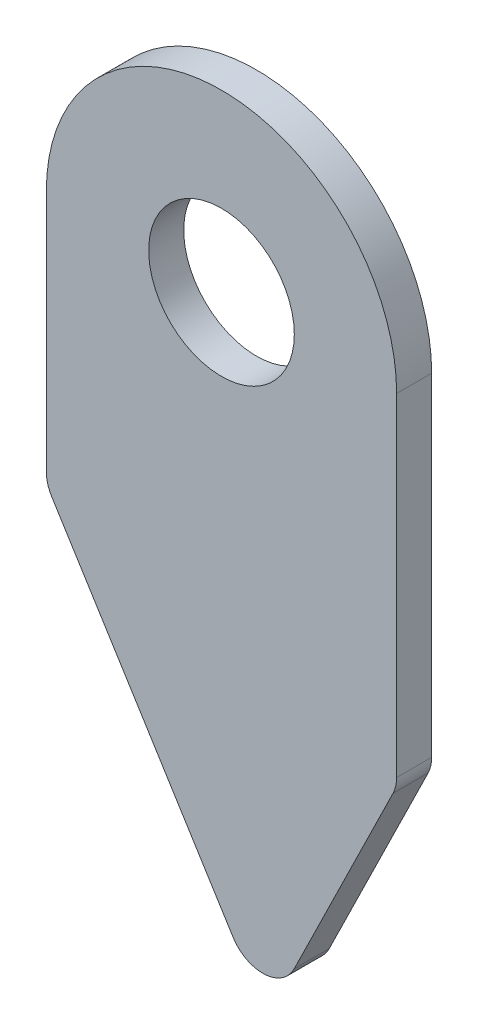
ISO-10303-21;
HEADER;
FILE_DESCRIPTION(('STEP AP214'),'2;1');
FILE_NAME('part.step','',(''),(''),'','','');
FILE_SCHEMA(('AUTOMOTIVE_DESIGN { 1 0 10303 214 1 1 1 1 }'));
ENDSEC;
DATA;
#1=APPLICATION_CONTEXT('core data for automotive mechanical design processes');
#2=APPLICATION_PROTOCOL_DEFINITION('international standard','automotive_design',2000,#1);
#3=PRODUCT_CONTEXT('',#1,'mechanical');
#4=PRODUCT('Part','Part','',(#3));
#5=PRODUCT_RELATED_PRODUCT_CATEGORY('part','',(#4));
#6=PRODUCT_DEFINITION_FORMATION('','',#4);
#7=PRODUCT_DEFINITION_CONTEXT('part definition',#1,'design');
#8=PRODUCT_DEFINITION('design','',#6,#7);
#9=PRODUCT_DEFINITION_SHAPE('','',#8);
#10=(LENGTH_UNIT() NAMED_UNIT(*) SI_UNIT(.MILLI.,.METRE.));
#11=(NAMED_UNIT(*) PLANE_ANGLE_UNIT() SI_UNIT($,.RADIAN.));
#12=(NAMED_UNIT(*) SI_UNIT($,.STERADIAN.) SOLID_ANGLE_UNIT());
#13=UNCERTAINTY_MEASURE_WITH_UNIT(LENGTH_MEASURE(1.E-05),#10,'distance_accuracy_value','');
#14=(GEOMETRIC_REPRESENTATION_CONTEXT(3) GLOBAL_UNCERTAINTY_ASSIGNED_CONTEXT((#13)) GLOBAL_UNIT_ASSIGNED_CONTEXT((#10,
#11,#12)) REPRESENTATION_CONTEXT('',''));
#15=CARTESIAN_POINT('',(0.,0.,0.));
#16=DIRECTION('',(0.,0.,1.));
#17=DIRECTION('',(1.,0.,0.));
#18=AXIS2_PLACEMENT_3D('',#15,#16,#17);
#19=CARTESIAN_POINT('',(0.,0.,1.5875));
#20=DIRECTION('',(0.,0.,-1.));
#21=DIRECTION('',(-1.,0.,0.));
#22=AXIS2_PLACEMENT_3D('',#19,#20,#21);
#23=CYLINDRICAL_SURFACE('',#22,7.9375);
#24=CARTESIAN_POINT('',(0.,0.,0.));
#25=DIRECTION('',(0.,0.,1.));
#26=DIRECTION('',(1.,0.,0.));
#27=AXIS2_PLACEMENT_3D('',#24,#25,#26);
#28=CIRCLE('',#27,7.9375);
#29=CARTESIAN_POINT('',(7.9375,0.,0.));
#30=VERTEX_POINT('',#29);
#31=CARTESIAN_POINT('',(-7.9375,0.,0.));
#32=VERTEX_POINT('',#31);
#33=EDGE_CURVE('E134',#30,#32,#28,.T.);
#34=ORIENTED_EDGE('',*,*,#33,.T.);
#35=DIRECTION('',(0.,0.,-1.));
#36=VECTOR('',#35,1.);
#37=CARTESIAN_POINT('',(-7.9375,0.,1.5875));
#38=LINE('',#37,#36);
#39=CARTESIAN_POINT('',(-7.9375,0.,1.5875));
#40=VERTEX_POINT('',#39);
#41=EDGE_CURVE('E115',#40,#32,#38,.T.);
#42=ORIENTED_EDGE('',*,*,#41,.F.);
#43=CARTESIAN_POINT('',(0.,0.,1.5875));
#44=DIRECTION('',(0.,0.,1.));
#45=DIRECTION('',(1.,0.,0.));
#46=AXIS2_PLACEMENT_3D('',#43,#44,#45);
#47=CIRCLE('',#46,7.9375);
#48=CARTESIAN_POINT('',(7.9375,0.,1.5875));
#49=VERTEX_POINT('',#48);
#50=EDGE_CURVE('E121',#49,#40,#47,.T.);
#51=ORIENTED_EDGE('',*,*,#50,.F.);
#52=DIRECTION('',(0.,0.,-1.));
#53=VECTOR('',#52,1.);
#54=CARTESIAN_POINT('',(7.9375,0.,1.5875));
#55=LINE('',#54,#53);
#56=EDGE_CURVE('E137',#49,#30,#55,.T.);
#57=ORIENTED_EDGE('',*,*,#56,.T.);
#58=EDGE_LOOP('',(#34,#42,#51,#57));
#59=FACE_BOUND('',#58,.T.);
#60=ADVANCED_FACE('F44',(#59),#23,.T.);
#61=CARTESIAN_POINT('',(-7.9375,0.,1.5875));
#62=DIRECTION('',(1.,0.,0.));
#63=DIRECTION('',(0.,1.,0.));
#64=AXIS2_PLACEMENT_3D('',#61,#62,#63);
#65=PLANE('',#64);
#66=DIRECTION('',(0.,-1.,0.));
#67=VECTOR('',#66,1.);
#68=CARTESIAN_POINT('',(-7.9375,0.,0.));
#69=LINE('',#68,#67);
#70=CARTESIAN_POINT('',(-7.9375,-11.0208016093663,0.));
#71=VERTEX_POINT('',#70);
#72=EDGE_CURVE('E219',#32,#71,#69,.T.);
#73=ORIENTED_EDGE('',*,*,#72,.T.);
#74=DIRECTION('',(0.,0.,1.));
#75=VECTOR('',#74,1.);
#76=CARTESIAN_POINT('',(-7.9375,-11.0208016093663,1.5875));
#77=LINE('',#76,#75);
#78=CARTESIAN_POINT('',(-7.9375,-11.0208016093663,1.5875));
#79=VERTEX_POINT('',#78);
#80=EDGE_CURVE('E12',#71,#79,#77,.T.);
#81=ORIENTED_EDGE('',*,*,#80,.T.);
#82=DIRECTION('',(0.,-1.,0.));
#83=VECTOR('',#82,1.);
#84=CARTESIAN_POINT('',(-7.9375,0.,1.5875));
#85=LINE('',#84,#83);
#86=EDGE_CURVE('E111',#40,#79,#85,.T.);
#87=ORIENTED_EDGE('',*,*,#86,.F.);
#88=ORIENTED_EDGE('',*,*,#41,.T.);
#89=EDGE_LOOP('',(#73,#81,#87,#88));
#90=FACE_BOUND('',#89,.T.);
#91=ADVANCED_FACE('F113',(#90),#65,.F.);
#92=CARTESIAN_POINT('',(7.9375,0.,1.5875));
#93=DIRECTION('',(-1.,0.,0.));
#94=DIRECTION('',(0.,-1.,0.));
#95=AXIS2_PLACEMENT_3D('',#92,#93,#94);
#96=PLANE('',#95);
#97=DIRECTION('',(0.,1.,0.));
#98=VECTOR('',#97,1.);
#99=CARTESIAN_POINT('',(7.9375,0.,1.5875));
#100=LINE('',#99,#98);
#101=CARTESIAN_POINT('',(7.9375,-15.07252516748,1.5875));
#102=VERTEX_POINT('',#101);
#103=EDGE_CURVE('E120',#102,#49,#100,.T.);
#104=ORIENTED_EDGE('',*,*,#103,.F.);
#105=DIRECTION('',(0.,0.,1.));
#106=VECTOR('',#105,1.);
#107=CARTESIAN_POINT('',(7.9375,-15.07252516748,1.5875));
#108=LINE('',#107,#106);
#109=CARTESIAN_POINT('',(7.9375,-15.07252516748,0.));
#110=VERTEX_POINT('',#109);
#111=EDGE_CURVE('E53',#102,#110,#108,.F.);
#112=ORIENTED_EDGE('',*,*,#111,.T.);
#113=DIRECTION('',(0.,1.,0.));
#114=VECTOR('',#113,1.);
#115=CARTESIAN_POINT('',(7.9375,0.,0.));
#116=LINE('',#115,#114);
#117=EDGE_CURVE('E131',#110,#30,#116,.T.);
#118=ORIENTED_EDGE('',*,*,#117,.T.);
#119=ORIENTED_EDGE('',*,*,#56,.F.);
#120=EDGE_LOOP('',(#104,#112,#118,#119));
#121=FACE_BOUND('',#120,.T.);
#122=ADVANCED_FACE('F228',(#121),#96,.F.);
#123=CARTESIAN_POINT('',(0.,0.,1.5875));
#124=DIRECTION('',(0.,0.,1.));
#125=DIRECTION('',(1.,0.,0.));
#126=AXIS2_PLACEMENT_3D('',#123,#124,#125);
#127=PLANE('',#126);
#128=DIRECTION('',(-0.529131580195711,0.848539787422835,0.));
#129=VECTOR('',#128,1.);
#130=CARTESIAN_POINT('',(-10.8674033396414,-6.77668435465262,1.5875));
#131=LINE('',#130,#129);
#132=CARTESIAN_POINT('',(0.522935225639818,-25.0427562101313,1.5875));
#133=VERTEX_POINT('',#132);
#134=CARTESIAN_POINT('',(-7.69705691253375,-11.8607979929269,1.5875));
#135=VERTEX_POINT('',#134);
#136=EDGE_CURVE('E193',#133,#135,#131,.T.);
#137=ORIENTED_EDGE('',*,*,#136,.F.);
#138=CARTESIAN_POINT('',(1.86999213817357,-24.2027598265706,1.5875));
#139=DIRECTION('',(0.,0.,1.));
#140=DIRECTION('',(1.,0.,0.));
#141=AXIS2_PLACEMENT_3D('',#138,#139,#140);
#142=CIRCLE('',#141,1.5875);
#143=CARTESIAN_POINT('',(3.295169567864,-24.9020634401041,1.5875));
#144=VERTEX_POINT('',#143);
#145=EDGE_CURVE('E154',#133,#144,#142,.T.);
#146=ORIENTED_EDGE('',*,*,#145,.T.);
#147=DIRECTION('',(-0.440506213249436,-0.897749562009719,0.));
#148=VECTOR('',#147,1.);
#149=CARTESIAN_POINT('',(12.5036320946513,-6.13526072187527,1.5875));
#150=LINE('',#149,#148);
#151=CARTESIAN_POINT('',(7.77517742969043,-15.7718287810135,1.5875));
#152=VERTEX_POINT('',#151);
#153=EDGE_CURVE('E192',#152,#144,#150,.T.);
#154=ORIENTED_EDGE('',*,*,#153,.F.);
#155=CARTESIAN_POINT('',(6.35,-15.07252516748,1.5875));
#156=DIRECTION('',(0.,0.,1.));
#157=DIRECTION('',(1.,0.,0.));
#158=AXIS2_PLACEMENT_3D('',#155,#156,#157);
#159=CIRCLE('',#158,1.5875);
#160=EDGE_CURVE('E151',#152,#102,#159,.T.);
#161=ORIENTED_EDGE('',*,*,#160,.T.);
#162=ORIENTED_EDGE('',*,*,#103,.T.);
#163=ORIENTED_EDGE('',*,*,#50,.T.);
#164=ORIENTED_EDGE('',*,*,#86,.T.);
#165=CARTESIAN_POINT('',(-6.35,-11.0208016093663,1.5875));
#166=DIRECTION('',(0.,0.,1.));
#167=DIRECTION('',(1.,0.,0.));
#168=AXIS2_PLACEMENT_3D('',#165,#166,#167);
#169=CIRCLE('',#168,1.5875);
#170=EDGE_CURVE('E148',#79,#135,#169,.T.);
#171=ORIENTED_EDGE('',*,*,#170,.T.);
#172=EDGE_LOOP('',(#137,#146,#154,#161,#162,#163,#164,#171));
#173=FACE_BOUND('',#172,.T.);
#174=CARTESIAN_POINT('',(0.,0.,1.5875));
#175=DIRECTION('',(0.,0.,1.));
#176=DIRECTION('',(1.,0.,0.));
#177=AXIS2_PLACEMENT_3D('',#174,#175,#176);
#178=CIRCLE('',#177,3.3);
#179=CARTESIAN_POINT('',(3.3,0.,1.5875));
#180=VERTEX_POINT('',#179);
#181=EDGE_CURVE('E187',#180,#180,#178,.T.);
#182=ORIENTED_EDGE('',*,*,#181,.F.);
#183=EDGE_LOOP('',(#182));
#184=FACE_BOUND('',#183,.T.);
#185=ADVANCED_FACE('F125',(#173,#184),#127,.T.);
#186=CARTESIAN_POINT('',(0.,0.,0.));
#187=DIRECTION('',(0.,0.,1.));
#188=DIRECTION('',(1.,0.,0.));
#189=AXIS2_PLACEMENT_3D('',#186,#187,#188);
#190=PLANE('',#189);
#191=CARTESIAN_POINT('',(0.,0.,0.));
#192=DIRECTION('',(0.,0.,1.));
#193=DIRECTION('',(1.,0.,0.));
#194=AXIS2_PLACEMENT_3D('',#191,#192,#193);
#195=CIRCLE('',#194,3.3);
#196=CARTESIAN_POINT('',(3.3,0.,0.));
#197=VERTEX_POINT('',#196);
#198=EDGE_CURVE('E207',#197,#197,#195,.T.);
#199=ORIENTED_EDGE('',*,*,#198,.T.);
#200=EDGE_LOOP('',(#199));
#201=FACE_BOUND('',#200,.T.);
#202=DIRECTION('',(-0.440506213249436,-0.897749562009719,0.));
#203=VECTOR('',#202,1.);
#204=CARTESIAN_POINT('',(12.5036320946513,-6.13526072187527,0.));
#205=LINE('',#204,#203);
#206=CARTESIAN_POINT('',(7.77517742969043,-15.7718287810135,0.));
#207=VERTEX_POINT('',#206);
#208=CARTESIAN_POINT('',(3.295169567864,-24.9020634401041,0.));
#209=VERTEX_POINT('',#208);
#210=EDGE_CURVE('E178',#207,#209,#205,.T.);
#211=ORIENTED_EDGE('',*,*,#210,.T.);
#212=CARTESIAN_POINT('',(1.86999213817357,-24.2027598265706,0.));
#213=DIRECTION('',(0.,0.,1.));
#214=DIRECTION('',(1.,0.,0.));
#215=AXIS2_PLACEMENT_3D('',#212,#213,#214);
#216=CIRCLE('',#215,1.5875);
#217=CARTESIAN_POINT('',(0.522935225639818,-25.0427562101313,0.));
#218=VERTEX_POINT('',#217);
#219=EDGE_CURVE('E169',#209,#218,#216,.F.);
#220=ORIENTED_EDGE('',*,*,#219,.T.);
#221=DIRECTION('',(-0.529131580195711,0.848539787422835,0.));
#222=VECTOR('',#221,1.);
#223=CARTESIAN_POINT('',(-10.8674033396414,-6.77668435465262,0.));
#224=LINE('',#223,#222);
#225=CARTESIAN_POINT('',(-7.69705691253375,-11.8607979929269,0.));
#226=VERTEX_POINT('',#225);
#227=EDGE_CURVE('E176',#218,#226,#224,.T.);
#228=ORIENTED_EDGE('',*,*,#227,.T.);
#229=CARTESIAN_POINT('',(-6.35,-11.0208016093663,0.));
#230=DIRECTION('',(0.,0.,1.));
#231=DIRECTION('',(1.,0.,0.));
#232=AXIS2_PLACEMENT_3D('',#229,#230,#231);
#233=CIRCLE('',#232,1.5875);
#234=EDGE_CURVE('E67',#226,#71,#233,.F.);
#235=ORIENTED_EDGE('',*,*,#234,.T.);
#236=ORIENTED_EDGE('',*,*,#72,.F.);
#237=ORIENTED_EDGE('',*,*,#33,.F.);
#238=ORIENTED_EDGE('',*,*,#117,.F.);
#239=CARTESIAN_POINT('',(6.35,-15.07252516748,0.));
#240=DIRECTION('',(0.,0.,1.));
#241=DIRECTION('',(1.,0.,0.));
#242=AXIS2_PLACEMENT_3D('',#239,#240,#241);
#243=CIRCLE('',#242,1.5875);
#244=EDGE_CURVE('E166',#110,#207,#243,.F.);
#245=ORIENTED_EDGE('',*,*,#244,.T.);
#246=EDGE_LOOP('',(#211,#220,#228,#235,#236,#237,#238,#245));
#247=FACE_BOUND('',#246,.T.);
#248=ADVANCED_FACE('F175',(#201,#247),#190,.F.);
#249=CARTESIAN_POINT('',(0.,0.,1.5875));
#250=DIRECTION('',(0.,0.,1.));
#251=DIRECTION('',(1.,0.,0.));
#252=AXIS2_PLACEMENT_3D('',#249,#250,#251);
#253=CYLINDRICAL_SURFACE('',#252,3.3);
#254=ORIENTED_EDGE('',*,*,#198,.F.);
#255=EDGE_LOOP('',(#254));
#256=FACE_BOUND('',#255,.T.);
#257=ORIENTED_EDGE('',*,*,#181,.T.);
#258=EDGE_LOOP('',(#257));
#259=FACE_BOUND('',#258,.T.);
#260=ADVANCED_FACE('F253',(#256,#259),#253,.F.);
#261=CARTESIAN_POINT('',(-10.8674033396414,-6.77668435465262,0.));
#262=DIRECTION('',(0.848539787422835,0.529131580195711,0.));
#263=DIRECTION('',(-0.529131580195711,0.848539787422835,0.));
#264=AXIS2_PLACEMENT_3D('',#261,#262,#263);
#265=PLANE('',#264);
#266=ORIENTED_EDGE('',*,*,#227,.F.);
#267=DIRECTION('',(0.,0.,1.));
#268=VECTOR('',#267,1.);
#269=CARTESIAN_POINT('',(0.522935225639818,-25.0427562101313,0.));
#270=LINE('',#269,#268);
#271=EDGE_CURVE('E141',#218,#133,#270,.T.);
#272=ORIENTED_EDGE('',*,*,#271,.T.);
#273=ORIENTED_EDGE('',*,*,#136,.T.);
#274=DIRECTION('',(0.,0.,1.));
#275=VECTOR('',#274,1.);
#276=CARTESIAN_POINT('',(-7.69705691253375,-11.8607979929269,0.));
#277=LINE('',#276,#275);
#278=EDGE_CURVE('E136',#135,#226,#277,.F.);
#279=ORIENTED_EDGE('',*,*,#278,.T.);
#280=EDGE_LOOP('',(#266,#272,#273,#279));
#281=FACE_BOUND('',#280,.T.);
#282=ADVANCED_FACE('F183',(#281),#265,.F.);
#283=CARTESIAN_POINT('',(12.5036320946513,-6.13526072187527,0.));
#284=DIRECTION('',(-0.897749562009719,0.440506213249436,0.));
#285=DIRECTION('',(-0.440506213249436,-0.897749562009719,0.));
#286=AXIS2_PLACEMENT_3D('',#283,#284,#285);
#287=PLANE('',#286);
#288=ORIENTED_EDGE('',*,*,#153,.T.);
#289=DIRECTION('',(0.,0.,1.));
#290=VECTOR('',#289,1.);
#291=CARTESIAN_POINT('',(3.295169567864,-24.9020634401041,0.));
#292=LINE('',#291,#290);
#293=EDGE_CURVE('E161',#144,#209,#292,.F.);
#294=ORIENTED_EDGE('',*,*,#293,.T.);
#295=ORIENTED_EDGE('',*,*,#210,.F.);
#296=DIRECTION('',(0.,0.,1.));
#297=VECTOR('',#296,1.);
#298=CARTESIAN_POINT('',(7.77517742969043,-15.7718287810135,0.));
#299=LINE('',#298,#297);
#300=EDGE_CURVE('E157',#207,#152,#299,.T.);
#301=ORIENTED_EDGE('',*,*,#300,.T.);
#302=EDGE_LOOP('',(#288,#294,#295,#301));
#303=FACE_BOUND('',#302,.T.);
#304=ADVANCED_FACE('F195',(#303),#287,.F.);
#305=CARTESIAN_POINT('',(1.86999213817357,-24.2027598265706,0.));
#306=DIRECTION('',(0.,0.,1.));
#307=DIRECTION('',(1.,0.,0.));
#308=AXIS2_PLACEMENT_3D('',#305,#306,#307);
#309=CYLINDRICAL_SURFACE('',#308,1.5875);
#310=ORIENTED_EDGE('',*,*,#219,.F.);
#311=ORIENTED_EDGE('',*,*,#293,.F.);
#312=ORIENTED_EDGE('',*,*,#145,.F.);
#313=ORIENTED_EDGE('',*,*,#271,.F.);
#314=EDGE_LOOP('',(#310,#311,#312,#313));
#315=FACE_BOUND('',#314,.T.);
#316=ADVANCED_FACE('F189',(#315),#309,.T.);
#317=CARTESIAN_POINT('',(6.35,-15.07252516748,0.));
#318=DIRECTION('',(0.,0.,1.));
#319=DIRECTION('',(1.,0.,0.));
#320=AXIS2_PLACEMENT_3D('',#317,#318,#319);
#321=CYLINDRICAL_SURFACE('',#320,1.5875);
#322=ORIENTED_EDGE('',*,*,#244,.F.);
#323=ORIENTED_EDGE('',*,*,#111,.F.);
#324=ORIENTED_EDGE('',*,*,#160,.F.);
#325=ORIENTED_EDGE('',*,*,#300,.F.);
#326=EDGE_LOOP('',(#322,#323,#324,#325));
#327=FACE_BOUND('',#326,.T.);
#328=ADVANCED_FACE('F232',(#327),#321,.T.);
#329=CARTESIAN_POINT('',(-6.35,-11.0208016093663,1.5875));
#330=DIRECTION('',(0.,0.,1.));
#331=DIRECTION('',(1.,0.,0.));
#332=AXIS2_PLACEMENT_3D('',#329,#330,#331);
#333=CYLINDRICAL_SURFACE('',#332,1.5875);
#334=ORIENTED_EDGE('',*,*,#234,.F.);
#335=ORIENTED_EDGE('',*,*,#278,.F.);
#336=ORIENTED_EDGE('',*,*,#170,.F.);
#337=ORIENTED_EDGE('',*,*,#80,.F.);
#338=EDGE_LOOP('',(#334,#335,#336,#337));
#339=FACE_BOUND('',#338,.T.);
#340=ADVANCED_FACE('F46',(#339),#333,.T.);
#341=CLOSED_SHELL('',(#60,#91,#122,#185,#248,#260,#282,#304,#316,#328,#340));
#342=MANIFOLD_SOLID_BREP('B2',#341);
#343=ADVANCED_BREP_SHAPE_REPRESENTATION('',(#18,#342),#14);
#344=SHAPE_DEFINITION_REPRESENTATION(#9,#343);
ENDSEC;
END-ISO-10303-21;
